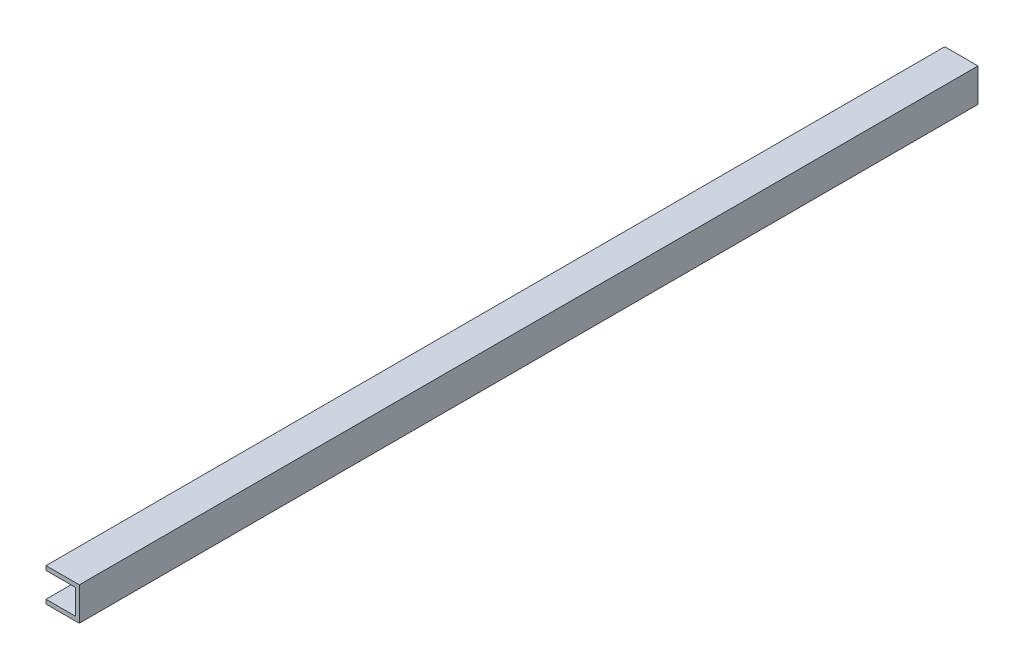
ISO-10303-21;
HEADER;
FILE_DESCRIPTION(('STEP AP214'),'2;1');
FILE_NAME('part.step','',(''),(''),'','','');
FILE_SCHEMA(('AUTOMOTIVE_DESIGN { 1 0 10303 214 1 1 1 1 }'));
ENDSEC;
DATA;
#1=APPLICATION_CONTEXT('core data for automotive mechanical design processes');
#2=APPLICATION_PROTOCOL_DEFINITION('international standard','automotive_design',2000,#1);
#3=PRODUCT_CONTEXT('',#1,'mechanical');
#4=PRODUCT('Part','Part','',(#3));
#5=PRODUCT_RELATED_PRODUCT_CATEGORY('part','',(#4));
#6=PRODUCT_DEFINITION_FORMATION('','',#4);
#7=PRODUCT_DEFINITION_CONTEXT('part definition',#1,'design');
#8=PRODUCT_DEFINITION('design','',#6,#7);
#9=PRODUCT_DEFINITION_SHAPE('','',#8);
#10=(LENGTH_UNIT() NAMED_UNIT(*) SI_UNIT(.MILLI.,.METRE.));
#11=(NAMED_UNIT(*) PLANE_ANGLE_UNIT() SI_UNIT($,.RADIAN.));
#12=(NAMED_UNIT(*) SI_UNIT($,.STERADIAN.) SOLID_ANGLE_UNIT());
#13=UNCERTAINTY_MEASURE_WITH_UNIT(LENGTH_MEASURE(1.E-05),#10,'distance_accuracy_value','');
#14=(GEOMETRIC_REPRESENTATION_CONTEXT(3) GLOBAL_UNCERTAINTY_ASSIGNED_CONTEXT((#13)) GLOBAL_UNIT_ASSIGNED_CONTEXT((#10,
#11,#12)) REPRESENTATION_CONTEXT('',''));
#15=CARTESIAN_POINT('',(0.,0.,0.));
#16=DIRECTION('',(0.,0.,1.));
#17=DIRECTION('',(1.,0.,0.));
#18=AXIS2_PLACEMENT_3D('',#15,#16,#17);
#19=CARTESIAN_POINT('',(17.0472140461187,0.477156811834216,685.8));
#20=DIRECTION('',(0.,-1.,0.));
#21=DIRECTION('',(1.,0.,0.));
#22=AXIS2_PLACEMENT_3D('',#19,#20,#21);
#23=PLANE('',#22);
#24=DIRECTION('',(-1.,0.,0.));
#25=VECTOR('',#24,1.);
#26=CARTESIAN_POINT('',(17.0472140461187,0.477156811834216,0.));
#27=LINE('',#26,#25);
#28=CARTESIAN_POINT('',(17.0472140461187,0.477156811834216,0.));
#29=VERTEX_POINT('',#28);
#30=CARTESIAN_POINT('',(-8.35278595388133,0.477156811834216,0.));
#31=VERTEX_POINT('',#30);
#32=EDGE_CURVE('E129',#29,#31,#27,.T.);
#33=ORIENTED_EDGE('',*,*,#32,.T.);
#34=DIRECTION('',(0.,0.,-1.));
#35=VECTOR('',#34,1.);
#36=CARTESIAN_POINT('',(-8.35278595388133,0.477156811834216,685.8));
#37=LINE('',#36,#35);
#38=CARTESIAN_POINT('',(-8.35278595388133,0.477156811834216,685.8));
#39=VERTEX_POINT('',#38);
#40=EDGE_CURVE('E11',#39,#31,#37,.T.);
#41=ORIENTED_EDGE('',*,*,#40,.F.);
#42=DIRECTION('',(-1.,0.,0.));
#43=VECTOR('',#42,1.);
#44=CARTESIAN_POINT('',(17.0472140461187,0.477156811834216,685.8));
#45=LINE('',#44,#43);
#46=CARTESIAN_POINT('',(17.0472140461187,0.477156811834216,685.8));
#47=VERTEX_POINT('',#46);
#48=EDGE_CURVE('E143',#47,#39,#45,.T.);
#49=ORIENTED_EDGE('',*,*,#48,.F.);
#50=DIRECTION('',(0.,0.,-1.));
#51=VECTOR('',#50,1.);
#52=CARTESIAN_POINT('',(17.0472140461187,0.477156811834216,685.8));
#53=LINE('',#52,#51);
#54=EDGE_CURVE('E125',#47,#29,#53,.T.);
#55=ORIENTED_EDGE('',*,*,#54,.T.);
#56=EDGE_LOOP('',(#33,#41,#49,#55));
#57=FACE_BOUND('',#56,.T.);
#58=ADVANCED_FACE('F33',(#57),#23,.F.);
#59=CARTESIAN_POINT('',(-8.35278595388133,0.477156811834216,685.8));
#60=DIRECTION('',(1.,0.,0.));
#61=DIRECTION('',(0.,0.,-1.));
#62=AXIS2_PLACEMENT_3D('',#59,#60,#61);
#63=PLANE('',#62);
#64=DIRECTION('',(0.,-1.,0.));
#65=VECTOR('',#64,1.);
#66=CARTESIAN_POINT('',(-8.35278595388133,0.477156811834216,0.));
#67=LINE('',#66,#65);
#68=CARTESIAN_POINT('',(-8.35278595388133,-2.69784318816578,0.));
#69=VERTEX_POINT('',#68);
#70=EDGE_CURVE('E132',#31,#69,#67,.T.);
#71=ORIENTED_EDGE('',*,*,#70,.T.);
#72=DIRECTION('',(0.,0.,-1.));
#73=VECTOR('',#72,1.);
#74=CARTESIAN_POINT('',(-8.35278595388133,-2.69784318816578,685.8));
#75=LINE('',#74,#73);
#76=CARTESIAN_POINT('',(-8.35278595388133,-2.69784318816578,685.8));
#77=VERTEX_POINT('',#76);
#78=EDGE_CURVE('E41',#77,#69,#75,.T.);
#79=ORIENTED_EDGE('',*,*,#78,.F.);
#80=DIRECTION('',(0.,-1.,0.));
#81=VECTOR('',#80,1.);
#82=CARTESIAN_POINT('',(-8.35278595388133,0.477156811834216,685.8));
#83=LINE('',#82,#81);
#84=EDGE_CURVE('E92',#39,#77,#83,.T.);
#85=ORIENTED_EDGE('',*,*,#84,.F.);
#86=ORIENTED_EDGE('',*,*,#40,.T.);
#87=EDGE_LOOP('',(#71,#79,#85,#86));
#88=FACE_BOUND('',#87,.T.);
#89=ADVANCED_FACE('F178',(#88),#63,.F.);
#90=CARTESIAN_POINT('',(-8.35278595388133,-2.69784318816578,685.8));
#91=DIRECTION('',(0.,1.,0.));
#92=DIRECTION('',(0.,0.,1.));
#93=AXIS2_PLACEMENT_3D('',#90,#91,#92);
#94=PLANE('',#93);
#95=DIRECTION('',(1.,0.,0.));
#96=VECTOR('',#95,1.);
#97=CARTESIAN_POINT('',(-8.35278595388133,-2.69784318816578,0.));
#98=LINE('',#97,#96);
#99=CARTESIAN_POINT('',(13.9992140461187,-2.69784318816578,0.));
#100=VERTEX_POINT('',#99);
#101=EDGE_CURVE('E134',#69,#100,#98,.T.);
#102=ORIENTED_EDGE('',*,*,#101,.T.);
#103=DIRECTION('',(0.,0.,-1.));
#104=VECTOR('',#103,1.);
#105=CARTESIAN_POINT('',(13.9992140461187,-2.69784318816578,685.8));
#106=LINE('',#105,#104);
#107=CARTESIAN_POINT('',(13.9992140461187,-2.69784318816578,685.8));
#108=VERTEX_POINT('',#107);
#109=EDGE_CURVE('E150',#108,#100,#106,.T.);
#110=ORIENTED_EDGE('',*,*,#109,.F.);
#111=DIRECTION('',(1.,0.,0.));
#112=VECTOR('',#111,1.);
#113=CARTESIAN_POINT('',(-8.35278595388133,-2.69784318816578,685.8));
#114=LINE('',#113,#112);
#115=EDGE_CURVE('E158',#77,#108,#114,.T.);
#116=ORIENTED_EDGE('',*,*,#115,.F.);
#117=ORIENTED_EDGE('',*,*,#78,.T.);
#118=EDGE_LOOP('',(#102,#110,#116,#117));
#119=FACE_BOUND('',#118,.T.);
#120=ADVANCED_FACE('F156',(#119),#94,.F.);
#121=CARTESIAN_POINT('',(13.9992140461187,-2.69784318816578,685.8));
#122=DIRECTION('',(1.,0.,0.));
#123=DIRECTION('',(0.,1.,0.));
#124=AXIS2_PLACEMENT_3D('',#121,#122,#123);
#125=PLANE('',#124);
#126=DIRECTION('',(0.,-1.,0.));
#127=VECTOR('',#126,1.);
#128=CARTESIAN_POINT('',(13.9992140461187,-2.69784318816578,0.));
#129=LINE('',#128,#127);
#130=CARTESIAN_POINT('',(13.9992140461187,-21.7478431881658,0.));
#131=VERTEX_POINT('',#130);
#132=EDGE_CURVE('E136',#100,#131,#129,.T.);
#133=ORIENTED_EDGE('',*,*,#132,.T.);
#134=DIRECTION('',(0.,0.,-1.));
#135=VECTOR('',#134,1.);
#136=CARTESIAN_POINT('',(13.9992140461187,-21.7478431881658,685.8));
#137=LINE('',#136,#135);
#138=CARTESIAN_POINT('',(13.9992140461187,-21.7478431881658,685.8));
#139=VERTEX_POINT('',#138);
#140=EDGE_CURVE('E147',#139,#131,#137,.T.);
#141=ORIENTED_EDGE('',*,*,#140,.F.);
#142=DIRECTION('',(0.,-1.,0.));
#143=VECTOR('',#142,1.);
#144=CARTESIAN_POINT('',(13.9992140461187,-2.69784318816578,685.8));
#145=LINE('',#144,#143);
#146=EDGE_CURVE('E170',#108,#139,#145,.T.);
#147=ORIENTED_EDGE('',*,*,#146,.F.);
#148=ORIENTED_EDGE('',*,*,#109,.T.);
#149=EDGE_LOOP('',(#133,#141,#147,#148));
#150=FACE_BOUND('',#149,.T.);
#151=ADVANCED_FACE('F166',(#150),#125,.F.);
#152=CARTESIAN_POINT('',(13.9992140461187,-21.7478431881658,685.8));
#153=DIRECTION('',(0.,-1.,0.));
#154=DIRECTION('',(1.,0.,0.));
#155=AXIS2_PLACEMENT_3D('',#152,#153,#154);
#156=PLANE('',#155);
#157=DIRECTION('',(-1.,0.,0.));
#158=VECTOR('',#157,1.);
#159=CARTESIAN_POINT('',(13.9992140461187,-21.7478431881658,0.));
#160=LINE('',#159,#158);
#161=CARTESIAN_POINT('',(-8.35278595388133,-21.7478431881658,0.));
#162=VERTEX_POINT('',#161);
#163=EDGE_CURVE('E138',#131,#162,#160,.T.);
#164=ORIENTED_EDGE('',*,*,#163,.T.);
#165=DIRECTION('',(0.,0.,-1.));
#166=VECTOR('',#165,1.);
#167=CARTESIAN_POINT('',(-8.35278595388133,-21.7478431881658,685.8));
#168=LINE('',#167,#166);
#169=CARTESIAN_POINT('',(-8.35278595388133,-21.7478431881658,685.8));
#170=VERTEX_POINT('',#169);
#171=EDGE_CURVE('E120',#170,#162,#168,.T.);
#172=ORIENTED_EDGE('',*,*,#171,.F.);
#173=DIRECTION('',(-1.,0.,0.));
#174=VECTOR('',#173,1.);
#175=CARTESIAN_POINT('',(13.9992140461187,-21.7478431881658,685.8));
#176=LINE('',#175,#174);
#177=EDGE_CURVE('E111',#139,#170,#176,.T.);
#178=ORIENTED_EDGE('',*,*,#177,.F.);
#179=ORIENTED_EDGE('',*,*,#140,.T.);
#180=EDGE_LOOP('',(#164,#172,#178,#179));
#181=FACE_BOUND('',#180,.T.);
#182=ADVANCED_FACE('F169',(#181),#156,.F.);
#183=CARTESIAN_POINT('',(-8.35278595388133,-21.7478431881658,685.8));
#184=DIRECTION('',(1.,0.,0.));
#185=DIRECTION('',(0.,1.,0.));
#186=AXIS2_PLACEMENT_3D('',#183,#184,#185);
#187=PLANE('',#186);
#188=DIRECTION('',(0.,-1.,0.));
#189=VECTOR('',#188,1.);
#190=CARTESIAN_POINT('',(-8.35278595388133,-21.7478431881658,0.));
#191=LINE('',#190,#189);
#192=CARTESIAN_POINT('',(-8.35278595388134,-24.9228431881658,0.));
#193=VERTEX_POINT('',#192);
#194=EDGE_CURVE('E119',#162,#193,#191,.T.);
#195=ORIENTED_EDGE('',*,*,#194,.T.);
#196=DIRECTION('',(0.,0.,-1.));
#197=VECTOR('',#196,1.);
#198=CARTESIAN_POINT('',(-8.35278595388134,-24.9228431881658,685.8));
#199=LINE('',#198,#197);
#200=CARTESIAN_POINT('',(-8.35278595388134,-24.9228431881658,685.8));
#201=VERTEX_POINT('',#200);
#202=EDGE_CURVE('E116',#201,#193,#199,.T.);
#203=ORIENTED_EDGE('',*,*,#202,.F.);
#204=DIRECTION('',(0.,-1.,0.));
#205=VECTOR('',#204,1.);
#206=CARTESIAN_POINT('',(-8.35278595388133,-21.7478431881658,685.8));
#207=LINE('',#206,#205);
#208=EDGE_CURVE('E105',#170,#201,#207,.T.);
#209=ORIENTED_EDGE('',*,*,#208,.F.);
#210=ORIENTED_EDGE('',*,*,#171,.T.);
#211=EDGE_LOOP('',(#195,#203,#209,#210));
#212=FACE_BOUND('',#211,.T.);
#213=ADVANCED_FACE('F117',(#212),#187,.F.);
#214=CARTESIAN_POINT('',(-8.35278595388134,-24.9228431881658,685.8));
#215=DIRECTION('',(0.,1.,0.));
#216=DIRECTION('',(0.,0.,1.));
#217=AXIS2_PLACEMENT_3D('',#214,#215,#216);
#218=PLANE('',#217);
#219=DIRECTION('',(1.,0.,0.));
#220=VECTOR('',#219,1.);
#221=CARTESIAN_POINT('',(-8.35278595388134,-24.9228431881658,0.));
#222=LINE('',#221,#220);
#223=CARTESIAN_POINT('',(17.0472140461187,-24.9228431881658,0.));
#224=VERTEX_POINT('',#223);
#225=EDGE_CURVE('E78',#193,#224,#222,.T.);
#226=ORIENTED_EDGE('',*,*,#225,.T.);
#227=DIRECTION('',(0.,0.,-1.));
#228=VECTOR('',#227,1.);
#229=CARTESIAN_POINT('',(17.0472140461187,-24.9228431881658,685.8));
#230=LINE('',#229,#228);
#231=CARTESIAN_POINT('',(17.0472140461187,-24.9228431881658,685.8));
#232=VERTEX_POINT('',#231);
#233=EDGE_CURVE('E121',#232,#224,#230,.T.);
#234=ORIENTED_EDGE('',*,*,#233,.F.);
#235=DIRECTION('',(1.,0.,0.));
#236=VECTOR('',#235,1.);
#237=CARTESIAN_POINT('',(-8.35278595388134,-24.9228431881658,685.8));
#238=LINE('',#237,#236);
#239=EDGE_CURVE('E109',#201,#232,#238,.T.);
#240=ORIENTED_EDGE('',*,*,#239,.F.);
#241=ORIENTED_EDGE('',*,*,#202,.T.);
#242=EDGE_LOOP('',(#226,#234,#240,#241));
#243=FACE_BOUND('',#242,.T.);
#244=ADVANCED_FACE('F123',(#243),#218,.F.);
#245=CARTESIAN_POINT('',(17.0472140461187,-24.9228431881658,685.8));
#246=DIRECTION('',(-1.,0.,0.));
#247=DIRECTION('',(0.,0.,1.));
#248=AXIS2_PLACEMENT_3D('',#245,#246,#247);
#249=PLANE('',#248);
#250=DIRECTION('',(0.,1.,0.));
#251=VECTOR('',#250,1.);
#252=CARTESIAN_POINT('',(17.0472140461187,-24.9228431881658,0.));
#253=LINE('',#252,#251);
#254=EDGE_CURVE('E84',#224,#29,#253,.T.);
#255=ORIENTED_EDGE('',*,*,#254,.T.);
#256=ORIENTED_EDGE('',*,*,#54,.F.);
#257=DIRECTION('',(0.,1.,0.));
#258=VECTOR('',#257,1.);
#259=CARTESIAN_POINT('',(17.0472140461187,-24.9228431881658,685.8));
#260=LINE('',#259,#258);
#261=EDGE_CURVE('E49',#232,#47,#260,.T.);
#262=ORIENTED_EDGE('',*,*,#261,.F.);
#263=ORIENTED_EDGE('',*,*,#233,.T.);
#264=EDGE_LOOP('',(#255,#256,#262,#263));
#265=FACE_BOUND('',#264,.T.);
#266=ADVANCED_FACE('F194',(#265),#249,.F.);
#267=CARTESIAN_POINT('',(0.,0.,685.8));
#268=DIRECTION('',(0.,0.,1.));
#269=DIRECTION('',(1.,0.,0.));
#270=AXIS2_PLACEMENT_3D('',#267,#268,#269);
#271=PLANE('',#270);
#272=ORIENTED_EDGE('',*,*,#48,.T.);
#273=ORIENTED_EDGE('',*,*,#84,.T.);
#274=ORIENTED_EDGE('',*,*,#115,.T.);
#275=ORIENTED_EDGE('',*,*,#146,.T.);
#276=ORIENTED_EDGE('',*,*,#177,.T.);
#277=ORIENTED_EDGE('',*,*,#208,.T.);
#278=ORIENTED_EDGE('',*,*,#239,.T.);
#279=ORIENTED_EDGE('',*,*,#261,.T.);
#280=EDGE_LOOP('',(#272,#273,#274,#275,#276,#277,#278,#279));
#281=FACE_BOUND('',#280,.T.);
#282=ADVANCED_FACE('F107',(#281),#271,.T.);
#283=CARTESIAN_POINT('',(0.,0.,0.));
#284=DIRECTION('',(0.,0.,1.));
#285=DIRECTION('',(1.,0.,0.));
#286=AXIS2_PLACEMENT_3D('',#283,#284,#285);
#287=PLANE('',#286);
#288=ORIENTED_EDGE('',*,*,#32,.F.);
#289=ORIENTED_EDGE('',*,*,#254,.F.);
#290=ORIENTED_EDGE('',*,*,#225,.F.);
#291=ORIENTED_EDGE('',*,*,#194,.F.);
#292=ORIENTED_EDGE('',*,*,#163,.F.);
#293=ORIENTED_EDGE('',*,*,#132,.F.);
#294=ORIENTED_EDGE('',*,*,#101,.F.);
#295=ORIENTED_EDGE('',*,*,#70,.F.);
#296=EDGE_LOOP('',(#288,#289,#290,#291,#292,#293,#294,#295));
#297=FACE_BOUND('',#296,.T.);
#298=ADVANCED_FACE('F162',(#297),#287,.F.);
#299=CLOSED_SHELL('',(#58,#89,#120,#151,#182,#213,#244,#266,#282,#298));
#300=MANIFOLD_SOLID_BREP('B2',#299);
#301=ADVANCED_BREP_SHAPE_REPRESENTATION('',(#18,#300),#14);
#302=SHAPE_DEFINITION_REPRESENTATION(#9,#301);
ENDSEC;
END-ISO-10303-21;
